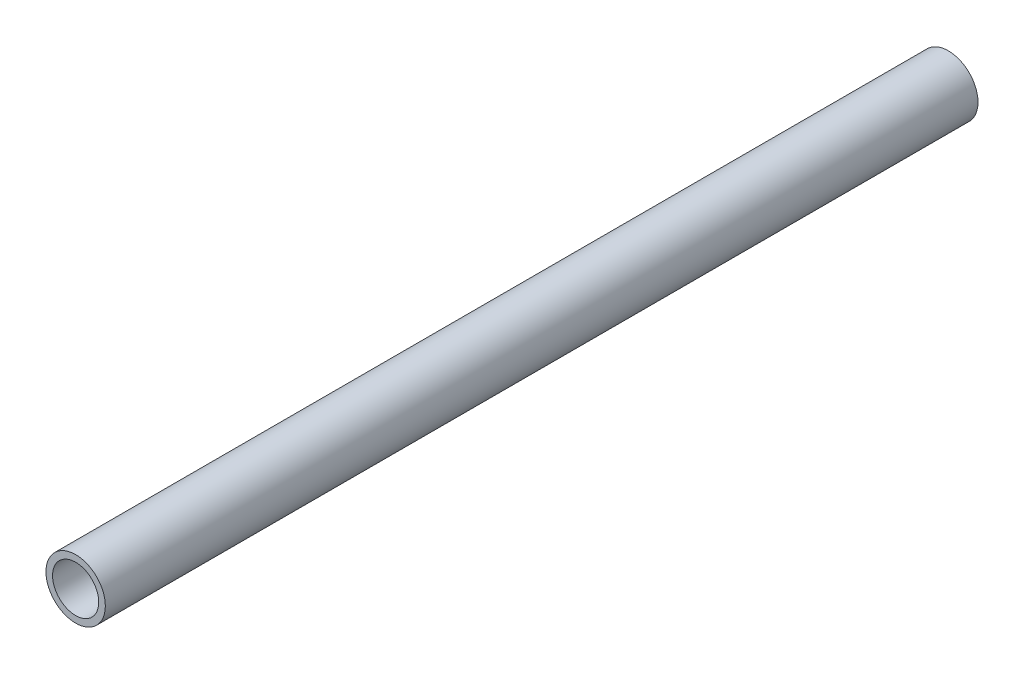
ISO-10303-21;
HEADER;
FILE_DESCRIPTION(('STEP AP214'),'2;1');
FILE_NAME('part.step','',(''),(''),'','','');
FILE_SCHEMA(('AUTOMOTIVE_DESIGN { 1 0 10303 214 1 1 1 1 }'));
ENDSEC;
DATA;
#1=APPLICATION_CONTEXT('core data for automotive mechanical design processes');
#2=APPLICATION_PROTOCOL_DEFINITION('international standard','automotive_design',2000,#1);
#3=PRODUCT_CONTEXT('',#1,'mechanical');
#4=PRODUCT('Part','Part','',(#3));
#5=PRODUCT_RELATED_PRODUCT_CATEGORY('part','',(#4));
#6=PRODUCT_DEFINITION_FORMATION('','',#4);
#7=PRODUCT_DEFINITION_CONTEXT('part definition',#1,'design');
#8=PRODUCT_DEFINITION('design','',#6,#7);
#9=PRODUCT_DEFINITION_SHAPE('','',#8);
#10=(LENGTH_UNIT() NAMED_UNIT(*) SI_UNIT(.MILLI.,.METRE.));
#11=(NAMED_UNIT(*) PLANE_ANGLE_UNIT() SI_UNIT($,.RADIAN.));
#12=(NAMED_UNIT(*) SI_UNIT($,.STERADIAN.) SOLID_ANGLE_UNIT());
#13=UNCERTAINTY_MEASURE_WITH_UNIT(LENGTH_MEASURE(1.E-05),#10,'distance_accuracy_value','');
#14=(GEOMETRIC_REPRESENTATION_CONTEXT(3) GLOBAL_UNCERTAINTY_ASSIGNED_CONTEXT((#13)) GLOBAL_UNIT_ASSIGNED_CONTEXT((#10,
#11,#12)) REPRESENTATION_CONTEXT('',''));
#15=CARTESIAN_POINT('',(0.,0.,0.));
#16=DIRECTION('',(0.,0.,1.));
#17=DIRECTION('',(1.,0.,0.));
#18=AXIS2_PLACEMENT_3D('',#15,#16,#17);
#19=CARTESIAN_POINT('',(0.,0.,264.45));
#20=DIRECTION('',(0.,0.,1.));
#21=DIRECTION('',(1.,0.,0.));
#22=AXIS2_PLACEMENT_3D('',#19,#20,#21);
#23=PLANE('',#22);
#24=CARTESIAN_POINT('',(0.,0.,264.45));
#25=DIRECTION('',(0.,0.,1.));
#26=DIRECTION('',(1.,0.,0.));
#27=AXIS2_PLACEMENT_3D('',#24,#25,#26);
#28=CIRCLE('',#27,9.);
#29=CARTESIAN_POINT('',(9.,0.,264.45));
#30=VERTEX_POINT('',#29);
#31=EDGE_CURVE('E10',#30,#30,#28,.T.);
#32=ORIENTED_EDGE('',*,*,#31,.T.);
#33=EDGE_LOOP('',(#32));
#34=FACE_BOUND('',#33,.T.);
#35=CARTESIAN_POINT('',(0.,0.,264.45));
#36=DIRECTION('',(0.,0.,1.));
#37=DIRECTION('',(1.,0.,0.));
#38=AXIS2_PLACEMENT_3D('',#35,#36,#37);
#39=CIRCLE('',#38,7.);
#40=CARTESIAN_POINT('',(7.,0.,264.45));
#41=VERTEX_POINT('',#40);
#42=EDGE_CURVE('E41',#41,#41,#39,.T.);
#43=ORIENTED_EDGE('',*,*,#42,.F.);
#44=EDGE_LOOP('',(#43));
#45=FACE_BOUND('',#44,.T.);
#46=ADVANCED_FACE('F30',(#34,#45),#23,.T.);
#47=CARTESIAN_POINT('',(0.,0.,0.));
#48=DIRECTION('',(0.,0.,1.));
#49=DIRECTION('',(1.,0.,0.));
#50=AXIS2_PLACEMENT_3D('',#47,#48,#49);
#51=PLANE('',#50);
#52=CARTESIAN_POINT('',(0.,0.,0.));
#53=DIRECTION('',(0.,0.,1.));
#54=DIRECTION('',(1.,0.,0.));
#55=AXIS2_PLACEMENT_3D('',#52,#53,#54);
#56=CIRCLE('',#55,9.);
#57=CARTESIAN_POINT('',(9.,0.,0.));
#58=VERTEX_POINT('',#57);
#59=EDGE_CURVE('E34',#58,#58,#56,.T.);
#60=ORIENTED_EDGE('',*,*,#59,.F.);
#61=EDGE_LOOP('',(#60));
#62=FACE_BOUND('',#61,.T.);
#63=CARTESIAN_POINT('',(0.,0.,0.));
#64=DIRECTION('',(0.,0.,1.));
#65=DIRECTION('',(1.,0.,0.));
#66=AXIS2_PLACEMENT_3D('',#63,#64,#65);
#67=CIRCLE('',#66,7.);
#68=CARTESIAN_POINT('',(7.,0.,0.));
#69=VERTEX_POINT('',#68);
#70=EDGE_CURVE('E43',#69,#69,#67,.T.);
#71=ORIENTED_EDGE('',*,*,#70,.T.);
#72=EDGE_LOOP('',(#71));
#73=FACE_BOUND('',#72,.T.);
#74=ADVANCED_FACE('F53',(#62,#73),#51,.F.);
#75=CARTESIAN_POINT('',(0.,0.,264.45));
#76=DIRECTION('',(0.,0.,-1.));
#77=DIRECTION('',(-1.,0.,0.));
#78=AXIS2_PLACEMENT_3D('',#75,#76,#77);
#79=CYLINDRICAL_SURFACE('',#78,9.);
#80=ORIENTED_EDGE('',*,*,#31,.F.);
#81=EDGE_LOOP('',(#80));
#82=FACE_BOUND('',#81,.T.);
#83=ORIENTED_EDGE('',*,*,#59,.T.);
#84=EDGE_LOOP('',(#83));
#85=FACE_BOUND('',#84,.T.);
#86=ADVANCED_FACE('F32',(#82,#85),#79,.T.);
#87=CARTESIAN_POINT('',(0.,0.,264.45));
#88=DIRECTION('',(0.,0.,-1.));
#89=DIRECTION('',(-1.,0.,0.));
#90=AXIS2_PLACEMENT_3D('',#87,#88,#89);
#91=CYLINDRICAL_SURFACE('',#90,7.);
#92=ORIENTED_EDGE('',*,*,#42,.T.);
#93=EDGE_LOOP('',(#92));
#94=FACE_BOUND('',#93,.T.);
#95=ORIENTED_EDGE('',*,*,#70,.F.);
#96=EDGE_LOOP('',(#95));
#97=FACE_BOUND('',#96,.T.);
#98=ADVANCED_FACE('F49',(#94,#97),#91,.F.);
#99=CLOSED_SHELL('',(#46,#74,#86,#98));
#100=MANIFOLD_SOLID_BREP('B2',#99);
#101=ADVANCED_BREP_SHAPE_REPRESENTATION('',(#18,#100),#14);
#102=SHAPE_DEFINITION_REPRESENTATION(#9,#101);
ENDSEC;
END-ISO-10303-21;
